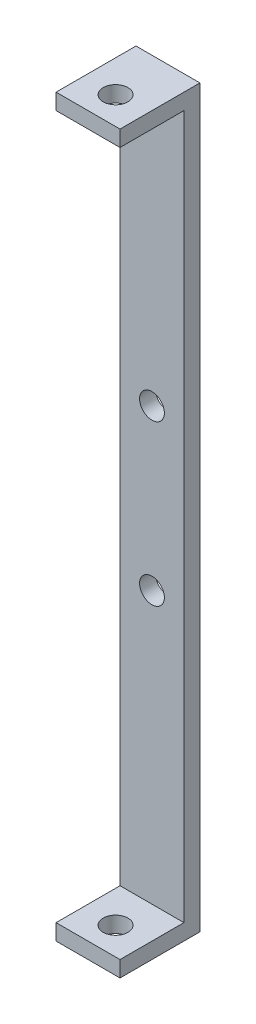
ISO-10303-21;
HEADER;
FILE_DESCRIPTION(('STEP AP214'),'2;1');
FILE_NAME('part.step','',(''),(''),'','','');
FILE_SCHEMA(('AUTOMOTIVE_DESIGN { 1 0 10303 214 1 1 1 1 }'));
ENDSEC;
DATA;
#1=APPLICATION_CONTEXT('core data for automotive mechanical design processes');
#2=APPLICATION_PROTOCOL_DEFINITION('international standard','automotive_design',2000,#1);
#3=PRODUCT_CONTEXT('',#1,'mechanical');
#4=PRODUCT('Part','Part','',(#3));
#5=PRODUCT_RELATED_PRODUCT_CATEGORY('part','',(#4));
#6=PRODUCT_DEFINITION_FORMATION('','',#4);
#7=PRODUCT_DEFINITION_CONTEXT('part definition',#1,'design');
#8=PRODUCT_DEFINITION('design','',#6,#7);
#9=PRODUCT_DEFINITION_SHAPE('','',#8);
#10=(LENGTH_UNIT() NAMED_UNIT(*) SI_UNIT(.MILLI.,.METRE.));
#11=(NAMED_UNIT(*) PLANE_ANGLE_UNIT() SI_UNIT($,.RADIAN.));
#12=(NAMED_UNIT(*) SI_UNIT($,.STERADIAN.) SOLID_ANGLE_UNIT());
#13=UNCERTAINTY_MEASURE_WITH_UNIT(LENGTH_MEASURE(1.E-05),#10,'distance_accuracy_value','');
#14=(GEOMETRIC_REPRESENTATION_CONTEXT(3) GLOBAL_UNCERTAINTY_ASSIGNED_CONTEXT((#13)) GLOBAL_UNIT_ASSIGNED_CONTEXT((#10,
#11,#12)) REPRESENTATION_CONTEXT('',''));
#15=CARTESIAN_POINT('',(0.,0.,0.));
#16=DIRECTION('',(0.,0.,1.));
#17=DIRECTION('',(1.,0.,0.));
#18=AXIS2_PLACEMENT_3D('',#15,#16,#17);
#19=CARTESIAN_POINT('',(8.,2.,0.));
#20=DIRECTION('',(0.,0.,-1.));
#21=DIRECTION('',(0.,1.,0.));
#22=AXIS2_PLACEMENT_3D('',#19,#20,#21);
#23=PLANE('',#22);
#24=DIRECTION('',(0.,-1.,0.));
#25=VECTOR('',#24,1.);
#26=CARTESIAN_POINT('',(0.,2.,0.));
#27=LINE('',#26,#25);
#28=CARTESIAN_POINT('',(0.,2.,0.));
#29=VERTEX_POINT('',#28);
#30=CARTESIAN_POINT('',(0.,0.,0.));
#31=VERTEX_POINT('',#30);
#32=EDGE_CURVE('E188',#29,#31,#27,.T.);
#33=ORIENTED_EDGE('',*,*,#32,.T.);
#34=DIRECTION('',(-1.,0.,0.));
#35=VECTOR('',#34,1.);
#36=CARTESIAN_POINT('',(8.,0.,0.));
#37=LINE('',#36,#35);
#38=CARTESIAN_POINT('',(8.,0.,0.));
#39=VERTEX_POINT('',#38);
#40=EDGE_CURVE('E12',#39,#31,#37,.T.);
#41=ORIENTED_EDGE('',*,*,#40,.F.);
#42=DIRECTION('',(0.,-1.,0.));
#43=VECTOR('',#42,1.);
#44=CARTESIAN_POINT('',(8.,2.,0.));
#45=LINE('',#44,#43);
#46=CARTESIAN_POINT('',(8.,2.,0.));
#47=VERTEX_POINT('',#46);
#48=EDGE_CURVE('E211',#47,#39,#45,.T.);
#49=ORIENTED_EDGE('',*,*,#48,.F.);
#50=DIRECTION('',(-1.,0.,0.));
#51=VECTOR('',#50,1.);
#52=CARTESIAN_POINT('',(8.,2.,0.));
#53=LINE('',#52,#51);
#54=EDGE_CURVE('E184',#47,#29,#53,.T.);
#55=ORIENTED_EDGE('',*,*,#54,.T.);
#56=EDGE_LOOP('',(#33,#41,#49,#55));
#57=FACE_BOUND('',#56,.T.);
#58=ADVANCED_FACE('F85',(#57),#23,.F.);
#59=CARTESIAN_POINT('',(8.,0.,0.));
#60=DIRECTION('',(0.,1.,0.));
#61=DIRECTION('',(0.,0.,1.));
#62=AXIS2_PLACEMENT_3D('',#59,#60,#61);
#63=PLANE('',#62);
#64=CARTESIAN_POINT('',(4.,0.,-3.44288655352898));
#65=DIRECTION('',(0.,1.,0.));
#66=DIRECTION('',(0.,0.,1.));
#67=AXIS2_PLACEMENT_3D('',#64,#65,#66);
#68=CIRCLE('',#67,1.55);
#69=CARTESIAN_POINT('',(4.,0.,-1.89288655352898));
#70=VERTEX_POINT('',#69);
#71=EDGE_CURVE('E242',#70,#70,#68,.T.);
#72=ORIENTED_EDGE('',*,*,#71,.T.);
#73=EDGE_LOOP('',(#72));
#74=FACE_BOUND('',#73,.T.);
#75=DIRECTION('',(0.,0.,-1.));
#76=VECTOR('',#75,1.);
#77=CARTESIAN_POINT('',(0.,0.,0.));
#78=LINE('',#77,#76);
#79=CARTESIAN_POINT('',(0.,0.,-10.));
#80=VERTEX_POINT('',#79);
#81=EDGE_CURVE('E192',#31,#80,#78,.T.);
#82=ORIENTED_EDGE('',*,*,#81,.T.);
#83=DIRECTION('',(-1.,0.,0.));
#84=VECTOR('',#83,1.);
#85=CARTESIAN_POINT('',(8.,0.,-10.));
#86=LINE('',#85,#84);
#87=CARTESIAN_POINT('',(8.,0.,-10.));
#88=VERTEX_POINT('',#87);
#89=EDGE_CURVE('E95',#88,#80,#86,.T.);
#90=ORIENTED_EDGE('',*,*,#89,.F.);
#91=DIRECTION('',(0.,0.,-1.));
#92=VECTOR('',#91,1.);
#93=CARTESIAN_POINT('',(8.,0.,0.));
#94=LINE('',#93,#92);
#95=EDGE_CURVE('E147',#39,#88,#94,.T.);
#96=ORIENTED_EDGE('',*,*,#95,.F.);
#97=ORIENTED_EDGE('',*,*,#40,.T.);
#98=EDGE_LOOP('',(#82,#90,#96,#97));
#99=FACE_BOUND('',#98,.T.);
#100=ADVANCED_FACE('F301',(#74,#99),#63,.F.);
#101=CARTESIAN_POINT('',(8.,0.,-10.));
#102=DIRECTION('',(0.,0.,1.));
#103=DIRECTION('',(1.,0.,0.));
#104=AXIS2_PLACEMENT_3D('',#101,#102,#103);
#105=PLANE('',#104);
#106=CARTESIAN_POINT('',(4.,36.,-10.));
#107=DIRECTION('',(0.,0.,1.));
#108=DIRECTION('',(1.,0.,0.));
#109=AXIS2_PLACEMENT_3D('',#106,#107,#108);
#110=CIRCLE('',#109,1.55);
#111=CARTESIAN_POINT('',(5.55,36.,-10.));
#112=VERTEX_POINT('',#111);
#113=EDGE_CURVE('E236',#112,#112,#110,.T.);
#114=ORIENTED_EDGE('',*,*,#113,.T.);
#115=EDGE_LOOP('',(#114));
#116=FACE_BOUND('',#115,.T.);
#117=CARTESIAN_POINT('',(4.,56.,-10.));
#118=DIRECTION('',(0.,0.,1.));
#119=DIRECTION('',(1.,0.,0.));
#120=AXIS2_PLACEMENT_3D('',#117,#118,#119);
#121=CIRCLE('',#120,1.55);
#122=CARTESIAN_POINT('',(5.55,56.,-10.));
#123=VERTEX_POINT('',#122);
#124=EDGE_CURVE('E244',#123,#123,#121,.T.);
#125=ORIENTED_EDGE('',*,*,#124,.T.);
#126=EDGE_LOOP('',(#125));
#127=FACE_BOUND('',#126,.T.);
#128=DIRECTION('',(0.,1.,0.));
#129=VECTOR('',#128,1.);
#130=CARTESIAN_POINT('',(0.,0.,-10.));
#131=LINE('',#130,#129);
#132=CARTESIAN_POINT('',(0.,92.,-10.));
#133=VERTEX_POINT('',#132);
#134=EDGE_CURVE('E196',#80,#133,#131,.T.);
#135=ORIENTED_EDGE('',*,*,#134,.T.);
#136=DIRECTION('',(-1.,0.,0.));
#137=VECTOR('',#136,1.);
#138=CARTESIAN_POINT('',(8.,92.,-10.));
#139=LINE('',#138,#137);
#140=CARTESIAN_POINT('',(8.,92.,-10.));
#141=VERTEX_POINT('',#140);
#142=EDGE_CURVE('E222',#141,#133,#139,.T.);
#143=ORIENTED_EDGE('',*,*,#142,.F.);
#144=DIRECTION('',(0.,1.,0.));
#145=VECTOR('',#144,1.);
#146=CARTESIAN_POINT('',(8.,0.,-10.));
#147=LINE('',#146,#145);
#148=EDGE_CURVE('E265',#88,#141,#147,.T.);
#149=ORIENTED_EDGE('',*,*,#148,.F.);
#150=ORIENTED_EDGE('',*,*,#89,.T.);
#151=EDGE_LOOP('',(#135,#143,#149,#150));
#152=FACE_BOUND('',#151,.T.);
#153=ADVANCED_FACE('F305',(#116,#127,#152),#105,.F.);
#154=CARTESIAN_POINT('',(8.,92.,-10.));
#155=DIRECTION('',(0.,-1.,0.));
#156=DIRECTION('',(0.,0.,-1.));
#157=AXIS2_PLACEMENT_3D('',#154,#155,#156);
#158=PLANE('',#157);
#159=CARTESIAN_POINT('',(4.,92.,-3.44288655352897));
#160=DIRECTION('',(0.,1.,0.));
#161=DIRECTION('',(0.,0.,1.));
#162=AXIS2_PLACEMENT_3D('',#159,#160,#161);
#163=CIRCLE('',#162,1.55);
#164=CARTESIAN_POINT('',(4.,92.,-1.89288655352897));
#165=VERTEX_POINT('',#164);
#166=EDGE_CURVE('E232',#165,#165,#163,.T.);
#167=ORIENTED_EDGE('',*,*,#166,.F.);
#168=EDGE_LOOP('',(#167));
#169=FACE_BOUND('',#168,.T.);
#170=DIRECTION('',(0.,0.,1.));
#171=VECTOR('',#170,1.);
#172=CARTESIAN_POINT('',(0.,92.,-10.));
#173=LINE('',#172,#171);
#174=CARTESIAN_POINT('',(0.,92.,0.));
#175=VERTEX_POINT('',#174);
#176=EDGE_CURVE('E199',#133,#175,#173,.T.);
#177=ORIENTED_EDGE('',*,*,#176,.T.);
#178=DIRECTION('',(-1.,0.,0.));
#179=VECTOR('',#178,1.);
#180=CARTESIAN_POINT('',(8.,92.,0.));
#181=LINE('',#180,#179);
#182=CARTESIAN_POINT('',(8.,92.,0.));
#183=VERTEX_POINT('',#182);
#184=EDGE_CURVE('E218',#183,#175,#181,.T.);
#185=ORIENTED_EDGE('',*,*,#184,.F.);
#186=DIRECTION('',(0.,0.,1.));
#187=VECTOR('',#186,1.);
#188=CARTESIAN_POINT('',(8.,92.,-10.));
#189=LINE('',#188,#187);
#190=EDGE_CURVE('E268',#141,#183,#189,.T.);
#191=ORIENTED_EDGE('',*,*,#190,.F.);
#192=ORIENTED_EDGE('',*,*,#142,.T.);
#193=EDGE_LOOP('',(#177,#185,#191,#192));
#194=FACE_BOUND('',#193,.T.);
#195=ADVANCED_FACE('F276',(#169,#194),#158,.F.);
#196=CARTESIAN_POINT('',(8.,92.,0.));
#197=DIRECTION('',(0.,0.,-1.));
#198=DIRECTION('',(0.,1.,0.));
#199=AXIS2_PLACEMENT_3D('',#196,#197,#198);
#200=PLANE('',#199);
#201=DIRECTION('',(0.,-1.,0.));
#202=VECTOR('',#201,1.);
#203=CARTESIAN_POINT('',(0.,92.,0.));
#204=LINE('',#203,#202);
#205=CARTESIAN_POINT('',(0.,90.,0.));
#206=VERTEX_POINT('',#205);
#207=EDGE_CURVE('E202',#175,#206,#204,.T.);
#208=ORIENTED_EDGE('',*,*,#207,.T.);
#209=DIRECTION('',(-1.,0.,0.));
#210=VECTOR('',#209,1.);
#211=CARTESIAN_POINT('',(8.,90.,0.));
#212=LINE('',#211,#210);
#213=CARTESIAN_POINT('',(8.,90.,0.));
#214=VERTEX_POINT('',#213);
#215=EDGE_CURVE('E177',#214,#206,#212,.T.);
#216=ORIENTED_EDGE('',*,*,#215,.F.);
#217=DIRECTION('',(0.,-1.,0.));
#218=VECTOR('',#217,1.);
#219=CARTESIAN_POINT('',(8.,92.,0.));
#220=LINE('',#219,#218);
#221=EDGE_CURVE('E166',#183,#214,#220,.T.);
#222=ORIENTED_EDGE('',*,*,#221,.F.);
#223=ORIENTED_EDGE('',*,*,#184,.T.);
#224=EDGE_LOOP('',(#208,#216,#222,#223));
#225=FACE_BOUND('',#224,.T.);
#226=ADVANCED_FACE('F280',(#225),#200,.F.);
#227=CARTESIAN_POINT('',(8.,90.,0.));
#228=DIRECTION('',(0.,1.,0.));
#229=DIRECTION('',(0.,0.,1.));
#230=AXIS2_PLACEMENT_3D('',#227,#228,#229);
#231=PLANE('',#230);
#232=CARTESIAN_POINT('',(4.,90.,-3.44288655352897));
#233=DIRECTION('',(0.,1.,0.));
#234=DIRECTION('',(0.,0.,1.));
#235=AXIS2_PLACEMENT_3D('',#232,#233,#234);
#236=CIRCLE('',#235,1.55);
#237=CARTESIAN_POINT('',(4.,90.,-1.89288655352897));
#238=VERTEX_POINT('',#237);
#239=EDGE_CURVE('E193',#238,#238,#236,.T.);
#240=ORIENTED_EDGE('',*,*,#239,.T.);
#241=EDGE_LOOP('',(#240));
#242=FACE_BOUND('',#241,.T.);
#243=DIRECTION('',(0.,0.,-1.));
#244=VECTOR('',#243,1.);
#245=CARTESIAN_POINT('',(0.,90.,0.));
#246=LINE('',#245,#244);
#247=CARTESIAN_POINT('',(0.,90.,-8.));
#248=VERTEX_POINT('',#247);
#249=EDGE_CURVE('E175',#206,#248,#246,.T.);
#250=ORIENTED_EDGE('',*,*,#249,.T.);
#251=DIRECTION('',(-1.,0.,0.));
#252=VECTOR('',#251,1.);
#253=CARTESIAN_POINT('',(8.,90.,-8.));
#254=LINE('',#253,#252);
#255=CARTESIAN_POINT('',(8.,90.,-8.));
#256=VERTEX_POINT('',#255);
#257=EDGE_CURVE('E172',#256,#248,#254,.T.);
#258=ORIENTED_EDGE('',*,*,#257,.F.);
#259=DIRECTION('',(0.,0.,-1.));
#260=VECTOR('',#259,1.);
#261=CARTESIAN_POINT('',(8.,90.,0.));
#262=LINE('',#261,#260);
#263=EDGE_CURVE('E160',#214,#256,#262,.T.);
#264=ORIENTED_EDGE('',*,*,#263,.F.);
#265=ORIENTED_EDGE('',*,*,#215,.T.);
#266=EDGE_LOOP('',(#250,#258,#264,#265));
#267=FACE_BOUND('',#266,.T.);
#268=ADVANCED_FACE('F173',(#242,#267),#231,.F.);
#269=CARTESIAN_POINT('',(8.,90.,-8.));
#270=DIRECTION('',(0.,0.,-1.));
#271=DIRECTION('',(0.,1.,0.));
#272=AXIS2_PLACEMENT_3D('',#269,#270,#271);
#273=PLANE('',#272);
#274=CARTESIAN_POINT('',(4.,36.,-8.00000000000001));
#275=DIRECTION('',(0.,0.,-1.));
#276=DIRECTION('',(0.,1.,0.));
#277=AXIS2_PLACEMENT_3D('',#274,#275,#276);
#278=CIRCLE('',#277,1.55);
#279=CARTESIAN_POINT('',(4.,37.55,-8.00000000000001));
#280=VERTEX_POINT('',#279);
#281=EDGE_CURVE('E88',#280,#280,#278,.T.);
#282=ORIENTED_EDGE('',*,*,#281,.T.);
#283=EDGE_LOOP('',(#282));
#284=FACE_BOUND('',#283,.T.);
#285=CARTESIAN_POINT('',(4.,56.,-8.));
#286=DIRECTION('',(0.,0.,-1.));
#287=DIRECTION('',(0.,1.,0.));
#288=AXIS2_PLACEMENT_3D('',#285,#286,#287);
#289=CIRCLE('',#288,1.55);
#290=CARTESIAN_POINT('',(4.,57.55,-8.));
#291=VERTEX_POINT('',#290);
#292=EDGE_CURVE('E233',#291,#291,#289,.T.);
#293=ORIENTED_EDGE('',*,*,#292,.T.);
#294=EDGE_LOOP('',(#293));
#295=FACE_BOUND('',#294,.T.);
#296=DIRECTION('',(0.,-1.,0.));
#297=VECTOR('',#296,1.);
#298=CARTESIAN_POINT('',(0.,90.,-8.));
#299=LINE('',#298,#297);
#300=CARTESIAN_POINT('',(0.,2.,-8.00000000000001));
#301=VERTEX_POINT('',#300);
#302=EDGE_CURVE('E133',#248,#301,#299,.T.);
#303=ORIENTED_EDGE('',*,*,#302,.T.);
#304=DIRECTION('',(-1.,0.,0.));
#305=VECTOR('',#304,1.);
#306=CARTESIAN_POINT('',(8.,2.,-8.00000000000001));
#307=LINE('',#306,#305);
#308=CARTESIAN_POINT('',(8.,2.,-8.00000000000001));
#309=VERTEX_POINT('',#308);
#310=EDGE_CURVE('E178',#309,#301,#307,.T.);
#311=ORIENTED_EDGE('',*,*,#310,.F.);
#312=DIRECTION('',(0.,-1.,0.));
#313=VECTOR('',#312,1.);
#314=CARTESIAN_POINT('',(8.,90.,-8.));
#315=LINE('',#314,#313);
#316=EDGE_CURVE('E164',#256,#309,#315,.T.);
#317=ORIENTED_EDGE('',*,*,#316,.F.);
#318=ORIENTED_EDGE('',*,*,#257,.T.);
#319=EDGE_LOOP('',(#303,#311,#317,#318));
#320=FACE_BOUND('',#319,.T.);
#321=ADVANCED_FACE('F180',(#284,#295,#320),#273,.F.);
#322=CARTESIAN_POINT('',(8.,2.,-8.00000000000001));
#323=DIRECTION('',(0.,-1.,0.));
#324=DIRECTION('',(0.,0.,-1.));
#325=AXIS2_PLACEMENT_3D('',#322,#323,#324);
#326=PLANE('',#325);
#327=CARTESIAN_POINT('',(4.,2.,-3.44288655352898));
#328=DIRECTION('',(0.,-1.,0.));
#329=DIRECTION('',(0.,0.,-1.));
#330=AXIS2_PLACEMENT_3D('',#327,#328,#329);
#331=CIRCLE('',#330,1.55);
#332=CARTESIAN_POINT('',(4.,2.,-4.99288655352898));
#333=VERTEX_POINT('',#332);
#334=EDGE_CURVE('E229',#333,#333,#331,.T.);
#335=ORIENTED_EDGE('',*,*,#334,.T.);
#336=EDGE_LOOP('',(#335));
#337=FACE_BOUND('',#336,.T.);
#338=DIRECTION('',(0.,0.,1.));
#339=VECTOR('',#338,1.);
#340=CARTESIAN_POINT('',(0.,2.,-8.00000000000001));
#341=LINE('',#340,#339);
#342=EDGE_CURVE('E139',#301,#29,#341,.T.);
#343=ORIENTED_EDGE('',*,*,#342,.T.);
#344=ORIENTED_EDGE('',*,*,#54,.F.);
#345=DIRECTION('',(0.,0.,1.));
#346=VECTOR('',#345,1.);
#347=CARTESIAN_POINT('',(8.,2.,-8.00000000000001));
#348=LINE('',#347,#346);
#349=EDGE_CURVE('E104',#309,#47,#348,.T.);
#350=ORIENTED_EDGE('',*,*,#349,.F.);
#351=ORIENTED_EDGE('',*,*,#310,.T.);
#352=EDGE_LOOP('',(#343,#344,#350,#351));
#353=FACE_BOUND('',#352,.T.);
#354=ADVANCED_FACE('F288',(#337,#353),#326,.F.);
#355=CARTESIAN_POINT('',(8.,0.,0.));
#356=DIRECTION('',(1.,0.,0.));
#357=DIRECTION('',(0.,0.,-1.));
#358=AXIS2_PLACEMENT_3D('',#355,#356,#357);
#359=PLANE('',#358);
#360=ORIENTED_EDGE('',*,*,#48,.T.);
#361=ORIENTED_EDGE('',*,*,#95,.T.);
#362=ORIENTED_EDGE('',*,*,#148,.T.);
#363=ORIENTED_EDGE('',*,*,#190,.T.);
#364=ORIENTED_EDGE('',*,*,#221,.T.);
#365=ORIENTED_EDGE('',*,*,#263,.T.);
#366=ORIENTED_EDGE('',*,*,#316,.T.);
#367=ORIENTED_EDGE('',*,*,#349,.T.);
#368=EDGE_LOOP('',(#360,#361,#362,#363,#364,#365,#366,#367));
#369=FACE_BOUND('',#368,.T.);
#370=ADVANCED_FACE('F162',(#369),#359,.T.);
#371=CARTESIAN_POINT('',(0.,0.,0.));
#372=DIRECTION('',(1.,0.,0.));
#373=DIRECTION('',(0.,0.,-1.));
#374=AXIS2_PLACEMENT_3D('',#371,#372,#373);
#375=PLANE('',#374);
#376=ORIENTED_EDGE('',*,*,#32,.F.);
#377=ORIENTED_EDGE('',*,*,#342,.F.);
#378=ORIENTED_EDGE('',*,*,#302,.F.);
#379=ORIENTED_EDGE('',*,*,#249,.F.);
#380=ORIENTED_EDGE('',*,*,#207,.F.);
#381=ORIENTED_EDGE('',*,*,#176,.F.);
#382=ORIENTED_EDGE('',*,*,#134,.F.);
#383=ORIENTED_EDGE('',*,*,#81,.F.);
#384=EDGE_LOOP('',(#376,#377,#378,#379,#380,#381,#382,#383));
#385=FACE_BOUND('',#384,.T.);
#386=ADVANCED_FACE('F283',(#385),#375,.F.);
#387=CARTESIAN_POINT('',(4.,0.,-3.44288655352898));
#388=DIRECTION('',(0.,1.,0.));
#389=DIRECTION('',(0.,0.,1.));
#390=AXIS2_PLACEMENT_3D('',#387,#388,#389);
#391=CYLINDRICAL_SURFACE('',#390,1.55);
#392=ORIENTED_EDGE('',*,*,#71,.F.);
#393=EDGE_LOOP('',(#392));
#394=FACE_BOUND('',#393,.T.);
#395=ORIENTED_EDGE('',*,*,#334,.F.);
#396=EDGE_LOOP('',(#395));
#397=FACE_BOUND('',#396,.T.);
#398=ADVANCED_FACE('F326',(#394,#397),#391,.F.);
#399=ORIENTED_EDGE('',*,*,#166,.T.);
#400=EDGE_LOOP('',(#399));
#401=FACE_BOUND('',#400,.T.);
#402=ORIENTED_EDGE('',*,*,#239,.F.);
#403=EDGE_LOOP('',(#402));
#404=FACE_BOUND('',#403,.T.);
#405=ADVANCED_FACE('F323',(#401,#404),#391,.F.);
#406=CARTESIAN_POINT('',(4.,56.,-10.));
#407=DIRECTION('',(0.,0.,1.));
#408=DIRECTION('',(0.,-1.,0.));
#409=AXIS2_PLACEMENT_3D('',#406,#407,#408);
#410=CYLINDRICAL_SURFACE('',#409,1.55);
#411=ORIENTED_EDGE('',*,*,#124,.F.);
#412=EDGE_LOOP('',(#411));
#413=FACE_BOUND('',#412,.T.);
#414=ORIENTED_EDGE('',*,*,#292,.F.);
#415=EDGE_LOOP('',(#414));
#416=FACE_BOUND('',#415,.T.);
#417=ADVANCED_FACE('F325',(#413,#416),#410,.F.);
#418=CARTESIAN_POINT('',(4.,36.,-10.));
#419=DIRECTION('',(0.,0.,1.));
#420=DIRECTION('',(0.,-1.,0.));
#421=AXIS2_PLACEMENT_3D('',#418,#419,#420);
#422=CYLINDRICAL_SURFACE('',#421,1.55);
#423=ORIENTED_EDGE('',*,*,#113,.F.);
#424=EDGE_LOOP('',(#423));
#425=FACE_BOUND('',#424,.T.);
#426=ORIENTED_EDGE('',*,*,#281,.F.);
#427=EDGE_LOOP('',(#426));
#428=FACE_BOUND('',#427,.T.);
#429=ADVANCED_FACE('F333',(#425,#428),#422,.F.);
#430=CLOSED_SHELL('',(#58,#100,#153,#195,#226,#268,#321,#354,#370,#386,#398,#405,#417,#429));
#431=MANIFOLD_SOLID_BREP('B2',#430);
#432=ADVANCED_BREP_SHAPE_REPRESENTATION('',(#18,#431),#14);
#433=SHAPE_DEFINITION_REPRESENTATION(#9,#432);
ENDSEC;
END-ISO-10303-21;
